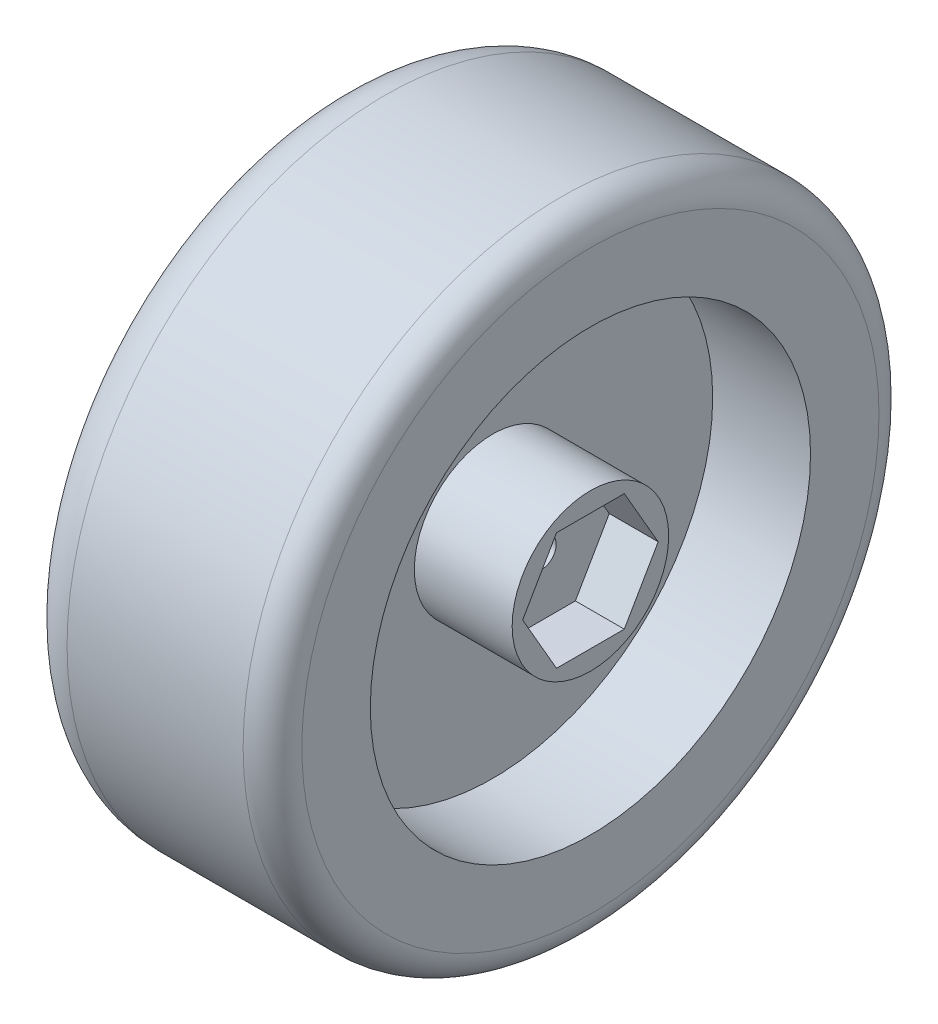
ISO-10303-21;
HEADER;
FILE_DESCRIPTION(('STEP AP214'),'2;1');
FILE_NAME('part.step','',(''),(''),'','','');
FILE_SCHEMA(('AUTOMOTIVE_DESIGN { 1 0 10303 214 1 1 1 1 }'));
ENDSEC;
DATA;
#1=APPLICATION_CONTEXT('core data for automotive mechanical design processes');
#2=APPLICATION_PROTOCOL_DEFINITION('international standard','automotive_design',2000,#1);
#3=PRODUCT_CONTEXT('',#1,'mechanical');
#4=PRODUCT('Part','Part','',(#3));
#5=PRODUCT_RELATED_PRODUCT_CATEGORY('part','',(#4));
#6=PRODUCT_DEFINITION_FORMATION('','',#4);
#7=PRODUCT_DEFINITION_CONTEXT('part definition',#1,'design');
#8=PRODUCT_DEFINITION('design','',#6,#7);
#9=PRODUCT_DEFINITION_SHAPE('','',#8);
#10=(LENGTH_UNIT() NAMED_UNIT(*) SI_UNIT(.MILLI.,.METRE.));
#11=(NAMED_UNIT(*) PLANE_ANGLE_UNIT() SI_UNIT($,.RADIAN.));
#12=(NAMED_UNIT(*) SI_UNIT($,.STERADIAN.) SOLID_ANGLE_UNIT());
#13=UNCERTAINTY_MEASURE_WITH_UNIT(LENGTH_MEASURE(1.E-05),#10,'distance_accuracy_value','');
#14=(GEOMETRIC_REPRESENTATION_CONTEXT(3) GLOBAL_UNCERTAINTY_ASSIGNED_CONTEXT((#13)) GLOBAL_UNIT_ASSIGNED_CONTEXT((#10,
#11,#12)) REPRESENTATION_CONTEXT('',''));
#15=CARTESIAN_POINT('',(0.,0.,0.));
#16=DIRECTION('',(0.,0.,1.));
#17=DIRECTION('',(1.,0.,0.));
#18=AXIS2_PLACEMENT_3D('',#15,#16,#17);
#19=CARTESIAN_POINT('',(26.,0.,0.));
#20=DIRECTION('',(-1.,0.,0.));
#21=DIRECTION('',(0.,0.,1.));
#22=AXIS2_PLACEMENT_3D('',#19,#20,#21);
#23=CYLINDRICAL_SURFACE('',#22,32.5);
#24=CARTESIAN_POINT('',(23.,0.,0.));
#25=DIRECTION('',(1.,0.,0.));
#26=DIRECTION('',(0.,0.,-1.));
#27=AXIS2_PLACEMENT_3D('',#24,#25,#26);
#28=CIRCLE('',#27,32.5);
#29=CARTESIAN_POINT('',(23.,0.,-32.5));
#30=VERTEX_POINT('',#29);
#31=EDGE_CURVE('E49',#30,#30,#28,.F.);
#32=ORIENTED_EDGE('',*,*,#31,.T.);
#33=EDGE_LOOP('',(#32));
#34=FACE_BOUND('',#33,.T.);
#35=CARTESIAN_POINT('',(5.,0.,0.));
#36=DIRECTION('',(-1.,0.,0.));
#37=DIRECTION('',(0.,0.,1.));
#38=AXIS2_PLACEMENT_3D('',#35,#36,#37);
#39=CIRCLE('',#38,32.5);
#40=CARTESIAN_POINT('',(5.,0.,32.5));
#41=VERTEX_POINT('',#40);
#42=EDGE_CURVE('E167',#41,#41,#39,.F.);
#43=ORIENTED_EDGE('',*,*,#42,.T.);
#44=EDGE_LOOP('',(#43));
#45=FACE_BOUND('',#44,.T.);
#46=ADVANCED_FACE('F41',(#34,#45),#23,.T.);
#47=CARTESIAN_POINT('',(26.,32.5,0.));
#48=DIRECTION('',(1.,0.,0.));
#49=DIRECTION('',(0.,0.,-1.));
#50=AXIS2_PLACEMENT_3D('',#47,#48,#49);
#51=PLANE('',#50);
#52=CARTESIAN_POINT('',(26.,0.,0.));
#53=DIRECTION('',(1.,0.,0.));
#54=DIRECTION('',(0.,0.,-1.));
#55=AXIS2_PLACEMENT_3D('',#52,#53,#54);
#56=CIRCLE('',#55,29.5);
#57=CARTESIAN_POINT('',(26.,0.,-29.5));
#58=VERTEX_POINT('',#57);
#59=EDGE_CURVE('E11',#58,#58,#56,.T.);
#60=ORIENTED_EDGE('',*,*,#59,.T.);
#61=EDGE_LOOP('',(#60));
#62=FACE_BOUND('',#61,.T.);
#63=CARTESIAN_POINT('',(26.,0.,0.));
#64=DIRECTION('',(1.,0.,0.));
#65=DIRECTION('',(0.,0.,-1.));
#66=AXIS2_PLACEMENT_3D('',#63,#64,#65);
#67=CIRCLE('',#66,22.5);
#68=CARTESIAN_POINT('',(26.,0.,-22.5));
#69=VERTEX_POINT('',#68);
#70=EDGE_CURVE('E152',#69,#69,#67,.T.);
#71=ORIENTED_EDGE('',*,*,#70,.F.);
#72=EDGE_LOOP('',(#71));
#73=FACE_BOUND('',#72,.T.);
#74=ADVANCED_FACE('F185',(#62,#73),#51,.T.);
#75=CARTESIAN_POINT('',(0.,0.,0.));
#76=DIRECTION('',(-1.,0.,0.));
#77=DIRECTION('',(0.,0.,1.));
#78=AXIS2_PLACEMENT_3D('',#75,#76,#77);
#79=PLANE('',#78);
#80=CARTESIAN_POINT('',(0.,0.,0.));
#81=DIRECTION('',(-1.,0.,0.));
#82=DIRECTION('',(0.,0.,1.));
#83=AXIS2_PLACEMENT_3D('',#80,#81,#82);
#84=CIRCLE('',#83,27.5);
#85=CARTESIAN_POINT('',(0.,0.,27.5));
#86=VERTEX_POINT('',#85);
#87=EDGE_CURVE('E161',#86,#86,#84,.T.);
#88=ORIENTED_EDGE('',*,*,#87,.T.);
#89=EDGE_LOOP('',(#88));
#90=FACE_BOUND('',#89,.T.);
#91=CARTESIAN_POINT('',(0.,0.,0.));
#92=DIRECTION('',(1.,0.,0.));
#93=DIRECTION('',(0.,0.,-1.));
#94=AXIS2_PLACEMENT_3D('',#91,#92,#93);
#95=CIRCLE('',#94,1.5);
#96=CARTESIAN_POINT('',(0.,0.,-1.5));
#97=VERTEX_POINT('',#96);
#98=EDGE_CURVE('E164',#97,#97,#95,.T.);
#99=ORIENTED_EDGE('',*,*,#98,.T.);
#100=EDGE_LOOP('',(#99));
#101=FACE_BOUND('',#100,.T.);
#102=ADVANCED_FACE('F189',(#90,#101),#79,.T.);
#103=CARTESIAN_POINT('',(16.,0.,0.));
#104=DIRECTION('',(-1.,0.,0.));
#105=DIRECTION('',(0.,0.,1.));
#106=AXIS2_PLACEMENT_3D('',#103,#104,#105);
#107=PLANE('',#106);
#108=CARTESIAN_POINT('',(16.,0.,0.));
#109=DIRECTION('',(-1.,0.,0.));
#110=DIRECTION('',(0.,0.,1.));
#111=AXIS2_PLACEMENT_3D('',#108,#109,#110);
#112=CIRCLE('',#111,8.);
#113=CARTESIAN_POINT('',(16.,0.,8.));
#114=VERTEX_POINT('',#113);
#115=EDGE_CURVE('E158',#114,#114,#112,.F.);
#116=ORIENTED_EDGE('',*,*,#115,.F.);
#117=EDGE_LOOP('',(#116));
#118=FACE_BOUND('',#117,.T.);
#119=CARTESIAN_POINT('',(16.,0.,0.));
#120=DIRECTION('',(1.,0.,0.));
#121=DIRECTION('',(0.,0.,-1.));
#122=AXIS2_PLACEMENT_3D('',#119,#120,#121);
#123=CIRCLE('',#122,22.5);
#124=CARTESIAN_POINT('',(16.,0.,-22.5));
#125=VERTEX_POINT('',#124);
#126=EDGE_CURVE('E155',#125,#125,#123,.T.);
#127=ORIENTED_EDGE('',*,*,#126,.T.);
#128=EDGE_LOOP('',(#127));
#129=FACE_BOUND('',#128,.T.);
#130=ADVANCED_FACE('F195',(#118,#129),#107,.F.);
#131=CARTESIAN_POINT('',(26.,0.,0.));
#132=DIRECTION('',(1.,0.,0.));
#133=DIRECTION('',(0.,0.,-1.));
#134=AXIS2_PLACEMENT_3D('',#131,#132,#133);
#135=CYLINDRICAL_SURFACE('',#134,22.5);
#136=ORIENTED_EDGE('',*,*,#126,.F.);
#137=EDGE_LOOP('',(#136));
#138=FACE_BOUND('',#137,.T.);
#139=ORIENTED_EDGE('',*,*,#70,.T.);
#140=EDGE_LOOP('',(#139));
#141=FACE_BOUND('',#140,.T.);
#142=ADVANCED_FACE('F199',(#138,#141),#135,.F.);
#143=CARTESIAN_POINT('',(26.,0.,0.));
#144=DIRECTION('',(-1.,0.,0.));
#145=DIRECTION('',(0.,0.,1.));
#146=AXIS2_PLACEMENT_3D('',#143,#144,#145);
#147=CYLINDRICAL_SURFACE('',#146,8.);
#148=CARTESIAN_POINT('',(26.,0.,0.));
#149=DIRECTION('',(1.,0.,0.));
#150=DIRECTION('',(0.,0.,-1.));
#151=AXIS2_PLACEMENT_3D('',#148,#149,#150);
#152=CIRCLE('',#151,8.);
#153=CARTESIAN_POINT('',(26.,0.,-8.));
#154=VERTEX_POINT('',#153);
#155=EDGE_CURVE('E144',#154,#154,#152,.T.);
#156=ORIENTED_EDGE('',*,*,#155,.F.);
#157=EDGE_LOOP('',(#156));
#158=FACE_BOUND('',#157,.T.);
#159=ORIENTED_EDGE('',*,*,#115,.T.);
#160=EDGE_LOOP('',(#159));
#161=FACE_BOUND('',#160,.T.);
#162=ADVANCED_FACE('F203',(#158,#161),#147,.T.);
#163=CARTESIAN_POINT('',(26.,0.,0.));
#164=DIRECTION('',(1.,0.,0.));
#165=DIRECTION('',(0.,0.,-1.));
#166=AXIS2_PLACEMENT_3D('',#163,#164,#165);
#167=PLANE('',#166);
#168=DIRECTION('',(0.,0.,-1.));
#169=VECTOR('',#168,1.);
#170=CARTESIAN_POINT('',(26.,-6.,3.46410161513776));
#171=LINE('',#170,#169);
#172=CARTESIAN_POINT('',(26.,-6.,3.46410161513776));
#173=VERTEX_POINT('',#172);
#174=CARTESIAN_POINT('',(26.,-6.,-3.46410161513775));
#175=VERTEX_POINT('',#174);
#176=EDGE_CURVE('E56',#173,#175,#171,.T.);
#177=ORIENTED_EDGE('',*,*,#176,.F.);
#178=DIRECTION('',(0.,-0.866025403784439,-0.5));
#179=VECTOR('',#178,1.);
#180=CARTESIAN_POINT('',(26.,0.,6.92820323027551));
#181=LINE('',#180,#179);
#182=CARTESIAN_POINT('',(26.,0.,6.92820323027551));
#183=VERTEX_POINT('',#182);
#184=EDGE_CURVE('E140',#183,#173,#181,.T.);
#185=ORIENTED_EDGE('',*,*,#184,.F.);
#186=DIRECTION('',(0.,-0.866025403784438,0.5));
#187=VECTOR('',#186,1.);
#188=CARTESIAN_POINT('',(26.,6.,3.46410161513776));
#189=LINE('',#188,#187);
#190=CARTESIAN_POINT('',(26.,6.,3.46410161513776));
#191=VERTEX_POINT('',#190);
#192=EDGE_CURVE('E138',#191,#183,#189,.T.);
#193=ORIENTED_EDGE('',*,*,#192,.F.);
#194=DIRECTION('',(0.,0.,1.));
#195=VECTOR('',#194,1.);
#196=CARTESIAN_POINT('',(26.,6.,-3.46410161513776));
#197=LINE('',#196,#195);
#198=CARTESIAN_POINT('',(26.,6.,-3.46410161513776));
#199=VERTEX_POINT('',#198);
#200=EDGE_CURVE('E104',#199,#191,#197,.T.);
#201=ORIENTED_EDGE('',*,*,#200,.F.);
#202=DIRECTION('',(0.,0.866025403784438,0.5));
#203=VECTOR('',#202,1.);
#204=CARTESIAN_POINT('',(26.,0.,-6.92820323027551));
#205=LINE('',#204,#203);
#206=CARTESIAN_POINT('',(26.,0.,-6.92820323027551));
#207=VERTEX_POINT('',#206);
#208=EDGE_CURVE('E134',#207,#199,#205,.T.);
#209=ORIENTED_EDGE('',*,*,#208,.F.);
#210=DIRECTION('',(0.,0.866025403784438,-0.500000000000001));
#211=VECTOR('',#210,1.);
#212=CARTESIAN_POINT('',(26.,-6.,-3.46410161513775));
#213=LINE('',#212,#211);
#214=EDGE_CURVE('E130',#175,#207,#213,.T.);
#215=ORIENTED_EDGE('',*,*,#214,.F.);
#216=EDGE_LOOP('',(#177,#185,#193,#201,#209,#215));
#217=FACE_BOUND('',#216,.T.);
#218=ORIENTED_EDGE('',*,*,#155,.T.);
#219=EDGE_LOOP('',(#218));
#220=FACE_BOUND('',#219,.T.);
#221=ADVANCED_FACE('F207',(#217,#220),#167,.T.);
#222=CARTESIAN_POINT('',(21.,-6.,3.46410161513776));
#223=DIRECTION('',(0.,-1.,0.));
#224=DIRECTION('',(0.,0.,-1.));
#225=AXIS2_PLACEMENT_3D('',#222,#223,#224);
#226=PLANE('',#225);
#227=ORIENTED_EDGE('',*,*,#176,.T.);
#228=DIRECTION('',(1.,0.,0.));
#229=VECTOR('',#228,1.);
#230=CARTESIAN_POINT('',(21.,-6.,-3.46410161513775));
#231=LINE('',#230,#229);
#232=CARTESIAN_POINT('',(21.,-6.,-3.46410161513775));
#233=VERTEX_POINT('',#232);
#234=EDGE_CURVE('E86',#233,#175,#231,.T.);
#235=ORIENTED_EDGE('',*,*,#234,.F.);
#236=DIRECTION('',(0.,0.,-1.));
#237=VECTOR('',#236,1.);
#238=CARTESIAN_POINT('',(21.,-6.,3.46410161513776));
#239=LINE('',#238,#237);
#240=CARTESIAN_POINT('',(21.,-6.,3.46410161513776));
#241=VERTEX_POINT('',#240);
#242=EDGE_CURVE('E142',#241,#233,#239,.T.);
#243=ORIENTED_EDGE('',*,*,#242,.F.);
#244=DIRECTION('',(1.,0.,0.));
#245=VECTOR('',#244,1.);
#246=CARTESIAN_POINT('',(21.,-6.,3.46410161513776));
#247=LINE('',#246,#245);
#248=EDGE_CURVE('E64',#241,#173,#247,.T.);
#249=ORIENTED_EDGE('',*,*,#248,.T.);
#250=EDGE_LOOP('',(#227,#235,#243,#249));
#251=FACE_BOUND('',#250,.T.);
#252=ADVANCED_FACE('F211',(#251),#226,.F.);
#253=CARTESIAN_POINT('',(21.,0.,6.92820323027551));
#254=DIRECTION('',(0.,-0.5,0.866025403784439));
#255=DIRECTION('',(0.,-0.866025403784439,-0.5));
#256=AXIS2_PLACEMENT_3D('',#253,#254,#255);
#257=PLANE('',#256);
#258=ORIENTED_EDGE('',*,*,#184,.T.);
#259=ORIENTED_EDGE('',*,*,#248,.F.);
#260=DIRECTION('',(0.,-0.866025403784439,-0.5));
#261=VECTOR('',#260,1.);
#262=CARTESIAN_POINT('',(21.,0.,6.92820323027551));
#263=LINE('',#262,#261);
#264=CARTESIAN_POINT('',(21.,0.,6.92820323027551));
#265=VERTEX_POINT('',#264);
#266=EDGE_CURVE('E116',#265,#241,#263,.T.);
#267=ORIENTED_EDGE('',*,*,#266,.F.);
#268=DIRECTION('',(1.,0.,0.));
#269=VECTOR('',#268,1.);
#270=CARTESIAN_POINT('',(21.,0.,6.92820323027551));
#271=LINE('',#270,#269);
#272=EDGE_CURVE('E108',#265,#183,#271,.T.);
#273=ORIENTED_EDGE('',*,*,#272,.T.);
#274=EDGE_LOOP('',(#258,#259,#267,#273));
#275=FACE_BOUND('',#274,.T.);
#276=ADVANCED_FACE('F215',(#275),#257,.F.);
#277=CARTESIAN_POINT('',(21.,6.,3.46410161513776));
#278=DIRECTION('',(0.,0.5,0.866025403784439));
#279=DIRECTION('',(0.,-0.866025403784439,0.5));
#280=AXIS2_PLACEMENT_3D('',#277,#278,#279);
#281=PLANE('',#280);
#282=ORIENTED_EDGE('',*,*,#192,.T.);
#283=ORIENTED_EDGE('',*,*,#272,.F.);
#284=DIRECTION('',(0.,-0.866025403784438,0.5));
#285=VECTOR('',#284,1.);
#286=CARTESIAN_POINT('',(21.,6.,3.46410161513776));
#287=LINE('',#286,#285);
#288=CARTESIAN_POINT('',(21.,6.,3.46410161513776));
#289=VERTEX_POINT('',#288);
#290=EDGE_CURVE('E112',#289,#265,#287,.T.);
#291=ORIENTED_EDGE('',*,*,#290,.F.);
#292=DIRECTION('',(1.,0.,0.));
#293=VECTOR('',#292,1.);
#294=CARTESIAN_POINT('',(21.,6.,3.46410161513776));
#295=LINE('',#294,#293);
#296=EDGE_CURVE('E97',#289,#191,#295,.T.);
#297=ORIENTED_EDGE('',*,*,#296,.T.);
#298=EDGE_LOOP('',(#282,#283,#291,#297));
#299=FACE_BOUND('',#298,.T.);
#300=ADVANCED_FACE('F113',(#299),#281,.F.);
#301=CARTESIAN_POINT('',(21.,6.,-3.46410161513776));
#302=DIRECTION('',(0.,1.,0.));
#303=DIRECTION('',(0.,0.,1.));
#304=AXIS2_PLACEMENT_3D('',#301,#302,#303);
#305=PLANE('',#304);
#306=ORIENTED_EDGE('',*,*,#200,.T.);
#307=ORIENTED_EDGE('',*,*,#296,.F.);
#308=DIRECTION('',(0.,0.,1.));
#309=VECTOR('',#308,1.);
#310=CARTESIAN_POINT('',(21.,6.,-3.46410161513776));
#311=LINE('',#310,#309);
#312=CARTESIAN_POINT('',(21.,6.,-3.46410161513776));
#313=VERTEX_POINT('',#312);
#314=EDGE_CURVE('E101',#313,#289,#311,.T.);
#315=ORIENTED_EDGE('',*,*,#314,.F.);
#316=DIRECTION('',(1.,0.,0.));
#317=VECTOR('',#316,1.);
#318=CARTESIAN_POINT('',(21.,6.,-3.46410161513776));
#319=LINE('',#318,#317);
#320=EDGE_CURVE('E109',#313,#199,#319,.T.);
#321=ORIENTED_EDGE('',*,*,#320,.T.);
#322=EDGE_LOOP('',(#306,#307,#315,#321));
#323=FACE_BOUND('',#322,.T.);
#324=ADVANCED_FACE('F99',(#323),#305,.F.);
#325=CARTESIAN_POINT('',(21.,0.,-6.92820323027551));
#326=DIRECTION('',(0.,0.5,-0.866025403784439));
#327=DIRECTION('',(0.,0.866025403784439,0.5));
#328=AXIS2_PLACEMENT_3D('',#325,#326,#327);
#329=PLANE('',#328);
#330=ORIENTED_EDGE('',*,*,#208,.T.);
#331=ORIENTED_EDGE('',*,*,#320,.F.);
#332=DIRECTION('',(0.,0.866025403784438,0.5));
#333=VECTOR('',#332,1.);
#334=CARTESIAN_POINT('',(21.,0.,-6.92820323027551));
#335=LINE('',#334,#333);
#336=CARTESIAN_POINT('',(21.,0.,-6.92820323027551));
#337=VERTEX_POINT('',#336);
#338=EDGE_CURVE('E122',#337,#313,#335,.T.);
#339=ORIENTED_EDGE('',*,*,#338,.F.);
#340=DIRECTION('',(1.,0.,0.));
#341=VECTOR('',#340,1.);
#342=CARTESIAN_POINT('',(21.,0.,-6.92820323027551));
#343=LINE('',#342,#341);
#344=EDGE_CURVE('E147',#337,#207,#343,.T.);
#345=ORIENTED_EDGE('',*,*,#344,.T.);
#346=EDGE_LOOP('',(#330,#331,#339,#345));
#347=FACE_BOUND('',#346,.T.);
#348=ADVANCED_FACE('F219',(#347),#329,.F.);
#349=CARTESIAN_POINT('',(21.,-6.,-3.46410161513775));
#350=DIRECTION('',(0.,-0.500000000000001,-0.866025403784438));
#351=DIRECTION('',(0.,0.866025403784438,-0.500000000000001));
#352=AXIS2_PLACEMENT_3D('',#349,#350,#351);
#353=PLANE('',#352);
#354=ORIENTED_EDGE('',*,*,#214,.T.);
#355=ORIENTED_EDGE('',*,*,#344,.F.);
#356=DIRECTION('',(0.,0.866025403784438,-0.500000000000001));
#357=VECTOR('',#356,1.);
#358=CARTESIAN_POINT('',(21.,-6.,-3.46410161513775));
#359=LINE('',#358,#357);
#360=EDGE_CURVE('E124',#233,#337,#359,.T.);
#361=ORIENTED_EDGE('',*,*,#360,.F.);
#362=ORIENTED_EDGE('',*,*,#234,.T.);
#363=EDGE_LOOP('',(#354,#355,#361,#362));
#364=FACE_BOUND('',#363,.T.);
#365=ADVANCED_FACE('F216',(#364),#353,.F.);
#366=CARTESIAN_POINT('',(21.,0.,0.));
#367=DIRECTION('',(1.,0.,0.));
#368=DIRECTION('',(0.,0.,-1.));
#369=AXIS2_PLACEMENT_3D('',#366,#367,#368);
#370=PLANE('',#369);
#371=CARTESIAN_POINT('',(21.,0.,0.));
#372=DIRECTION('',(1.,0.,0.));
#373=DIRECTION('',(0.,0.,-1.));
#374=AXIS2_PLACEMENT_3D('',#371,#372,#373);
#375=CIRCLE('',#374,1.5);
#376=CARTESIAN_POINT('',(21.,0.,-1.5));
#377=VERTEX_POINT('',#376);
#378=EDGE_CURVE('E131',#377,#377,#375,.F.);
#379=ORIENTED_EDGE('',*,*,#378,.T.);
#380=EDGE_LOOP('',(#379));
#381=FACE_BOUND('',#380,.T.);
#382=ORIENTED_EDGE('',*,*,#242,.T.);
#383=ORIENTED_EDGE('',*,*,#360,.T.);
#384=ORIENTED_EDGE('',*,*,#338,.T.);
#385=ORIENTED_EDGE('',*,*,#314,.T.);
#386=ORIENTED_EDGE('',*,*,#290,.T.);
#387=ORIENTED_EDGE('',*,*,#266,.T.);
#388=EDGE_LOOP('',(#382,#383,#384,#385,#386,#387));
#389=FACE_BOUND('',#388,.T.);
#390=ADVANCED_FACE('F119',(#381,#389),#370,.T.);
#391=CARTESIAN_POINT('',(26.,0.,0.));
#392=DIRECTION('',(-1.,0.,0.));
#393=DIRECTION('',(0.,0.,1.));
#394=AXIS2_PLACEMENT_3D('',#391,#392,#393);
#395=CYLINDRICAL_SURFACE('',#394,1.5);
#396=ORIENTED_EDGE('',*,*,#378,.F.);
#397=EDGE_LOOP('',(#396));
#398=FACE_BOUND('',#397,.T.);
#399=ORIENTED_EDGE('',*,*,#98,.F.);
#400=EDGE_LOOP('',(#399));
#401=FACE_BOUND('',#400,.T.);
#402=ADVANCED_FACE('F181',(#398,#401),#395,.F.);
#403=CARTESIAN_POINT('',(5.,0.,0.));
#404=DIRECTION('',(-1.,0.,0.));
#405=DIRECTION('',(0.,0.,1.));
#406=AXIS2_PLACEMENT_3D('',#403,#404,#405);
#407=TOROIDAL_SURFACE('',#406,27.5,5.);
#408=ORIENTED_EDGE('',*,*,#42,.F.);
#409=EDGE_LOOP('',(#408));
#410=FACE_BOUND('',#409,.T.);
#411=ORIENTED_EDGE('',*,*,#87,.F.);
#412=EDGE_LOOP('',(#411));
#413=FACE_BOUND('',#412,.T.);
#414=ADVANCED_FACE('F175',(#410,#413),#407,.T.);
#415=CARTESIAN_POINT('',(23.,0.,0.));
#416=DIRECTION('',(1.,0.,0.));
#417=DIRECTION('',(0.,0.,-1.));
#418=AXIS2_PLACEMENT_3D('',#415,#416,#417);
#419=TOROIDAL_SURFACE('',#418,29.5,3.);
#420=ORIENTED_EDGE('',*,*,#59,.F.);
#421=EDGE_LOOP('',(#420));
#422=FACE_BOUND('',#421,.T.);
#423=ORIENTED_EDGE('',*,*,#31,.F.);
#424=EDGE_LOOP('',(#423));
#425=FACE_BOUND('',#424,.T.);
#426=ADVANCED_FACE('F43',(#422,#425),#419,.T.);
#427=CLOSED_SHELL('',(#46,#74,#102,#130,#142,#162,#221,#252,#276,#300,#324,#348,#365,#390,#402,
#414,#426));
#428=MANIFOLD_SOLID_BREP('B2',#427);
#429=ADVANCED_BREP_SHAPE_REPRESENTATION('',(#18,#428),#14);
#430=SHAPE_DEFINITION_REPRESENTATION(#9,#429);
ENDSEC;
END-ISO-10303-21;
